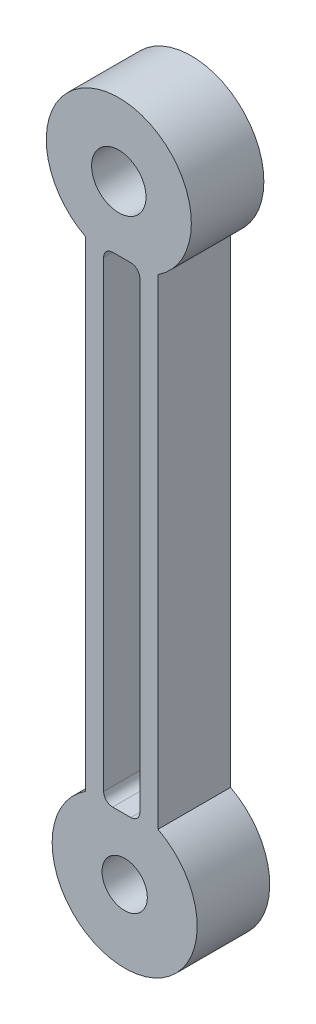
ISO-10303-21;
HEADER;
FILE_DESCRIPTION(('STEP AP214'),'2;1');
FILE_NAME('part.step','',(''),(''),'','','');
FILE_SCHEMA(('AUTOMOTIVE_DESIGN { 1 0 10303 214 1 1 1 1 }'));
ENDSEC;
DATA;
#1=APPLICATION_CONTEXT('core data for automotive mechanical design processes');
#2=APPLICATION_PROTOCOL_DEFINITION('international standard','automotive_design',2000,#1);
#3=PRODUCT_CONTEXT('',#1,'mechanical');
#4=PRODUCT('Part','Part','',(#3));
#5=PRODUCT_RELATED_PRODUCT_CATEGORY('part','',(#4));
#6=PRODUCT_DEFINITION_FORMATION('','',#4);
#7=PRODUCT_DEFINITION_CONTEXT('part definition',#1,'design');
#8=PRODUCT_DEFINITION('design','',#6,#7);
#9=PRODUCT_DEFINITION_SHAPE('','',#8);
#10=(LENGTH_UNIT() NAMED_UNIT(*) SI_UNIT(.MILLI.,.METRE.));
#11=(NAMED_UNIT(*) PLANE_ANGLE_UNIT() SI_UNIT($,.RADIAN.));
#12=(NAMED_UNIT(*) SI_UNIT($,.STERADIAN.) SOLID_ANGLE_UNIT());
#13=UNCERTAINTY_MEASURE_WITH_UNIT(LENGTH_MEASURE(1.E-05),#10,'distance_accuracy_value','');
#14=(GEOMETRIC_REPRESENTATION_CONTEXT(3) GLOBAL_UNCERTAINTY_ASSIGNED_CONTEXT((#13)) GLOBAL_UNIT_ASSIGNED_CONTEXT((#10,
#11,#12)) REPRESENTATION_CONTEXT('',''));
#15=CARTESIAN_POINT('',(0.,0.,0.));
#16=DIRECTION('',(0.,0.,1.));
#17=DIRECTION('',(1.,0.,0.));
#18=AXIS2_PLACEMENT_3D('',#15,#16,#17);
#19=CARTESIAN_POINT('',(0.,17.6256954531733,8.));
#20=DIRECTION('',(0.,1.,0.));
#21=DIRECTION('',(0.,0.,1.));
#22=AXIS2_PLACEMENT_3D('',#19,#20,#21);
#23=PLANE('',#22);
#24=DIRECTION('',(1.,0.,0.));
#25=VECTOR('',#24,1.);
#26=CARTESIAN_POINT('',(0.,17.6256954531733,0.));
#27=LINE('',#26,#25);
#28=CARTESIAN_POINT('',(-0.999999999999984,17.6256954531733,0.));
#29=VERTEX_POINT('',#28);
#30=CARTESIAN_POINT('',(1.,17.6256954531733,0.));
#31=VERTEX_POINT('',#30);
#32=EDGE_CURVE('E183',#29,#31,#27,.T.);
#33=ORIENTED_EDGE('',*,*,#32,.F.);
#34=DIRECTION('',(0.,0.,-1.));
#35=VECTOR('',#34,1.);
#36=CARTESIAN_POINT('',(-0.999999999999984,17.6256954531733,8.));
#37=LINE('',#36,#35);
#38=CARTESIAN_POINT('',(-0.999999999999984,17.6256954531733,8.));
#39=VERTEX_POINT('',#38);
#40=EDGE_CURVE('E11',#39,#29,#37,.T.);
#41=ORIENTED_EDGE('',*,*,#40,.F.);
#42=DIRECTION('',(1.,0.,0.));
#43=VECTOR('',#42,1.);
#44=CARTESIAN_POINT('',(0.,17.6256954531733,8.));
#45=LINE('',#44,#43);
#46=CARTESIAN_POINT('',(1.,17.6256954531733,8.));
#47=VERTEX_POINT('',#46);
#48=EDGE_CURVE('E297',#39,#47,#45,.T.);
#49=ORIENTED_EDGE('',*,*,#48,.T.);
#50=DIRECTION('',(0.,0.,-1.));
#51=VECTOR('',#50,1.);
#52=CARTESIAN_POINT('',(1.,17.6256954531733,8.));
#53=LINE('',#52,#51);
#54=EDGE_CURVE('E60',#47,#31,#53,.T.);
#55=ORIENTED_EDGE('',*,*,#54,.T.);
#56=EDGE_LOOP('',(#33,#41,#49,#55));
#57=FACE_BOUND('',#56,.T.);
#58=ADVANCED_FACE('F41',(#57),#23,.T.);
#59=CARTESIAN_POINT('',(-0.999999999999992,18.6256954531733,8.));
#60=DIRECTION('',(0.,0.,-1.));
#61=DIRECTION('',(-1.,0.,0.));
#62=AXIS2_PLACEMENT_3D('',#59,#60,#61);
#63=CYLINDRICAL_SURFACE('',#62,1.);
#64=CARTESIAN_POINT('',(-0.999999999999992,18.6256954531733,0.));
#65=DIRECTION('',(0.,0.,1.));
#66=DIRECTION('',(1.,0.,0.));
#67=AXIS2_PLACEMENT_3D('',#64,#65,#66);
#68=CIRCLE('',#67,1.);
#69=CARTESIAN_POINT('',(-1.99999999999999,18.6256954531733,0.));
#70=VERTEX_POINT('',#69);
#71=EDGE_CURVE('E185',#29,#70,#68,.F.);
#72=ORIENTED_EDGE('',*,*,#71,.T.);
#73=DIRECTION('',(0.,0.,-1.));
#74=VECTOR('',#73,1.);
#75=CARTESIAN_POINT('',(-1.99999999999999,18.6256954531733,8.));
#76=LINE('',#75,#74);
#77=CARTESIAN_POINT('',(-1.99999999999999,18.6256954531733,8.));
#78=VERTEX_POINT('',#77);
#79=EDGE_CURVE('E51',#78,#70,#76,.T.);
#80=ORIENTED_EDGE('',*,*,#79,.F.);
#81=CARTESIAN_POINT('',(-0.999999999999992,18.6256954531733,8.));
#82=DIRECTION('',(0.,0.,1.));
#83=DIRECTION('',(1.,0.,0.));
#84=AXIS2_PLACEMENT_3D('',#81,#82,#83);
#85=CIRCLE('',#84,1.);
#86=EDGE_CURVE('E299',#39,#78,#85,.F.);
#87=ORIENTED_EDGE('',*,*,#86,.F.);
#88=ORIENTED_EDGE('',*,*,#40,.T.);
#89=EDGE_LOOP('',(#72,#80,#87,#88));
#90=FACE_BOUND('',#89,.T.);
#91=ADVANCED_FACE('F248',(#90),#63,.F.);
#92=CARTESIAN_POINT('',(-1.99999999999999,0.,8.));
#93=DIRECTION('',(1.,0.,0.));
#94=DIRECTION('',(0.,1.,0.));
#95=AXIS2_PLACEMENT_3D('',#92,#93,#94);
#96=PLANE('',#95);
#97=DIRECTION('',(0.,-1.,0.));
#98=VECTOR('',#97,1.);
#99=CARTESIAN_POINT('',(-1.99999999999999,0.,0.));
#100=LINE('',#99,#98);
#101=CARTESIAN_POINT('',(-2.,69.6256954531733,0.));
#102=VERTEX_POINT('',#101);
#103=EDGE_CURVE('E188',#102,#70,#100,.T.);
#104=ORIENTED_EDGE('',*,*,#103,.F.);
#105=DIRECTION('',(0.,0.,-1.));
#106=VECTOR('',#105,1.);
#107=CARTESIAN_POINT('',(-2.,69.6256954531733,8.));
#108=LINE('',#107,#106);
#109=CARTESIAN_POINT('',(-2.,69.6256954531733,8.));
#110=VERTEX_POINT('',#109);
#111=EDGE_CURVE('E210',#110,#102,#108,.T.);
#112=ORIENTED_EDGE('',*,*,#111,.F.);
#113=DIRECTION('',(0.,-1.,0.));
#114=VECTOR('',#113,1.);
#115=CARTESIAN_POINT('',(-1.99999999999999,0.,8.));
#116=LINE('',#115,#114);
#117=EDGE_CURVE('E301',#110,#78,#116,.T.);
#118=ORIENTED_EDGE('',*,*,#117,.T.);
#119=ORIENTED_EDGE('',*,*,#79,.T.);
#120=EDGE_LOOP('',(#104,#112,#118,#119));
#121=FACE_BOUND('',#120,.T.);
#122=ADVANCED_FACE('F253',(#121),#96,.T.);
#123=CARTESIAN_POINT('',(-1.,69.6256954531733,8.));
#124=DIRECTION('',(0.,0.,-1.));
#125=DIRECTION('',(-1.,0.,0.));
#126=AXIS2_PLACEMENT_3D('',#123,#124,#125);
#127=CYLINDRICAL_SURFACE('',#126,1.);
#128=CARTESIAN_POINT('',(-1.,69.6256954531733,0.));
#129=DIRECTION('',(0.,0.,1.));
#130=DIRECTION('',(1.,0.,0.));
#131=AXIS2_PLACEMENT_3D('',#128,#129,#130);
#132=CIRCLE('',#131,1.);
#133=CARTESIAN_POINT('',(-1.,70.6256954531733,0.));
#134=VERTEX_POINT('',#133);
#135=EDGE_CURVE('E191',#102,#134,#132,.F.);
#136=ORIENTED_EDGE('',*,*,#135,.T.);
#137=DIRECTION('',(0.,0.,-1.));
#138=VECTOR('',#137,1.);
#139=CARTESIAN_POINT('',(-1.,70.6256954531733,8.));
#140=LINE('',#139,#138);
#141=CARTESIAN_POINT('',(-1.,70.6256954531733,8.));
#142=VERTEX_POINT('',#141);
#143=EDGE_CURVE('E207',#142,#134,#140,.T.);
#144=ORIENTED_EDGE('',*,*,#143,.F.);
#145=CARTESIAN_POINT('',(-1.,69.6256954531733,8.));
#146=DIRECTION('',(0.,0.,1.));
#147=DIRECTION('',(1.,0.,0.));
#148=AXIS2_PLACEMENT_3D('',#145,#146,#147);
#149=CIRCLE('',#148,1.);
#150=EDGE_CURVE('E304',#110,#142,#149,.F.);
#151=ORIENTED_EDGE('',*,*,#150,.F.);
#152=ORIENTED_EDGE('',*,*,#111,.T.);
#153=EDGE_LOOP('',(#136,#144,#151,#152));
#154=FACE_BOUND('',#153,.T.);
#155=ADVANCED_FACE('F259',(#154),#127,.F.);
#156=CARTESIAN_POINT('',(0.,70.6256954531733,8.));
#157=DIRECTION('',(0.,1.,0.));
#158=DIRECTION('',(0.,0.,1.));
#159=AXIS2_PLACEMENT_3D('',#156,#157,#158);
#160=PLANE('',#159);
#161=DIRECTION('',(1.,0.,0.));
#162=VECTOR('',#161,1.);
#163=CARTESIAN_POINT('',(0.,70.6256954531733,0.));
#164=LINE('',#163,#162);
#165=CARTESIAN_POINT('',(1.,70.6256954531733,0.));
#166=VERTEX_POINT('',#165);
#167=EDGE_CURVE('E194',#134,#166,#164,.T.);
#168=ORIENTED_EDGE('',*,*,#167,.T.);
#169=DIRECTION('',(0.,0.,-1.));
#170=VECTOR('',#169,1.);
#171=CARTESIAN_POINT('',(1.,70.6256954531733,8.));
#172=LINE('',#171,#170);
#173=CARTESIAN_POINT('',(1.,70.6256954531733,8.));
#174=VERTEX_POINT('',#173);
#175=EDGE_CURVE('E156',#174,#166,#172,.T.);
#176=ORIENTED_EDGE('',*,*,#175,.F.);
#177=DIRECTION('',(1.,0.,0.));
#178=VECTOR('',#177,1.);
#179=CARTESIAN_POINT('',(0.,70.6256954531733,8.));
#180=LINE('',#179,#178);
#181=EDGE_CURVE('E145',#142,#174,#180,.T.);
#182=ORIENTED_EDGE('',*,*,#181,.F.);
#183=ORIENTED_EDGE('',*,*,#143,.T.);
#184=EDGE_LOOP('',(#168,#176,#182,#183));
#185=FACE_BOUND('',#184,.T.);
#186=ADVANCED_FACE('F263',(#185),#160,.F.);
#187=CARTESIAN_POINT('',(1.,69.6256954531733,8.));
#188=DIRECTION('',(0.,0.,-1.));
#189=DIRECTION('',(-1.,0.,0.));
#190=AXIS2_PLACEMENT_3D('',#187,#188,#189);
#191=CYLINDRICAL_SURFACE('',#190,1.);
#192=CARTESIAN_POINT('',(1.,69.6256954531733,0.));
#193=DIRECTION('',(0.,0.,1.));
#194=DIRECTION('',(1.,0.,0.));
#195=AXIS2_PLACEMENT_3D('',#192,#193,#194);
#196=CIRCLE('',#195,1.);
#197=CARTESIAN_POINT('',(2.,69.6256954531733,0.));
#198=VERTEX_POINT('',#197);
#199=EDGE_CURVE('E153',#166,#198,#196,.F.);
#200=ORIENTED_EDGE('',*,*,#199,.T.);
#201=DIRECTION('',(0.,0.,-1.));
#202=VECTOR('',#201,1.);
#203=CARTESIAN_POINT('',(2.,69.6256954531733,8.));
#204=LINE('',#203,#202);
#205=CARTESIAN_POINT('',(2.,69.6256954531733,8.));
#206=VERTEX_POINT('',#205);
#207=EDGE_CURVE('E151',#206,#198,#204,.T.);
#208=ORIENTED_EDGE('',*,*,#207,.F.);
#209=CARTESIAN_POINT('',(1.,69.6256954531733,8.));
#210=DIRECTION('',(0.,0.,1.));
#211=DIRECTION('',(1.,0.,0.));
#212=AXIS2_PLACEMENT_3D('',#209,#210,#211);
#213=CIRCLE('',#212,1.);
#214=EDGE_CURVE('E137',#174,#206,#213,.F.);
#215=ORIENTED_EDGE('',*,*,#214,.F.);
#216=ORIENTED_EDGE('',*,*,#175,.T.);
#217=EDGE_LOOP('',(#200,#208,#215,#216));
#218=FACE_BOUND('',#217,.T.);
#219=ADVANCED_FACE('F152',(#218),#191,.F.);
#220=CARTESIAN_POINT('',(2.00000000000001,0.,8.));
#221=DIRECTION('',(-1.,0.,0.));
#222=DIRECTION('',(0.,-1.,0.));
#223=AXIS2_PLACEMENT_3D('',#220,#221,#222);
#224=PLANE('',#223);
#225=DIRECTION('',(0.,1.,0.));
#226=VECTOR('',#225,1.);
#227=CARTESIAN_POINT('',(2.00000000000001,0.,0.));
#228=LINE('',#227,#226);
#229=CARTESIAN_POINT('',(2.00000000000001,18.6256954531733,0.));
#230=VERTEX_POINT('',#229);
#231=EDGE_CURVE('E198',#230,#198,#228,.T.);
#232=ORIENTED_EDGE('',*,*,#231,.F.);
#233=DIRECTION('',(0.,0.,-1.));
#234=VECTOR('',#233,1.);
#235=CARTESIAN_POINT('',(2.00000000000001,18.6256954531733,8.));
#236=LINE('',#235,#234);
#237=CARTESIAN_POINT('',(2.00000000000001,18.6256954531733,8.));
#238=VERTEX_POINT('',#237);
#239=EDGE_CURVE('E97',#238,#230,#236,.T.);
#240=ORIENTED_EDGE('',*,*,#239,.F.);
#241=DIRECTION('',(0.,1.,0.));
#242=VECTOR('',#241,1.);
#243=CARTESIAN_POINT('',(2.00000000000001,0.,8.));
#244=LINE('',#243,#242);
#245=EDGE_CURVE('E143',#238,#206,#244,.T.);
#246=ORIENTED_EDGE('',*,*,#245,.T.);
#247=ORIENTED_EDGE('',*,*,#207,.T.);
#248=EDGE_LOOP('',(#232,#240,#246,#247));
#249=FACE_BOUND('',#248,.T.);
#250=ADVANCED_FACE('F158',(#249),#224,.T.);
#251=CARTESIAN_POINT('',(-4.,0.,8.));
#252=DIRECTION('',(-1.,0.,0.));
#253=DIRECTION('',(0.,0.,1.));
#254=AXIS2_PLACEMENT_3D('',#251,#252,#253);
#255=PLANE('',#254);
#256=DIRECTION('',(0.,1.,0.));
#257=VECTOR('',#256,1.);
#258=CARTESIAN_POINT('',(-4.,0.,0.));
#259=LINE('',#258,#257);
#260=CARTESIAN_POINT('',(-4.,17.6256954531733,0.));
#261=VERTEX_POINT('',#260);
#262=CARTESIAN_POINT('',(-4.,70.6256954531733,0.));
#263=VERTEX_POINT('',#262);
#264=EDGE_CURVE('E171',#261,#263,#259,.T.);
#265=ORIENTED_EDGE('',*,*,#264,.F.);
#266=DIRECTION('',(0.,0.,-1.));
#267=VECTOR('',#266,1.);
#268=CARTESIAN_POINT('',(-4.,17.6256954531733,8.));
#269=LINE('',#268,#267);
#270=CARTESIAN_POINT('',(-4.,17.6256954531733,8.));
#271=VERTEX_POINT('',#270);
#272=EDGE_CURVE('E45',#271,#261,#269,.T.);
#273=ORIENTED_EDGE('',*,*,#272,.F.);
#274=DIRECTION('',(0.,1.,0.));
#275=VECTOR('',#274,1.);
#276=CARTESIAN_POINT('',(-4.,0.,8.));
#277=LINE('',#276,#275);
#278=CARTESIAN_POINT('',(-4.,70.6256954531733,8.));
#279=VERTEX_POINT('',#278);
#280=EDGE_CURVE('E231',#271,#279,#277,.T.);
#281=ORIENTED_EDGE('',*,*,#280,.T.);
#282=DIRECTION('',(0.,0.,-1.));
#283=VECTOR('',#282,1.);
#284=CARTESIAN_POINT('',(-4.,70.6256954531733,8.));
#285=LINE('',#284,#283);
#286=EDGE_CURVE('E161',#279,#263,#285,.T.);
#287=ORIENTED_EDGE('',*,*,#286,.T.);
#288=EDGE_LOOP('',(#265,#273,#281,#287));
#289=FACE_BOUND('',#288,.T.);
#290=ADVANCED_FACE('F229',(#289),#255,.T.);
#291=CARTESIAN_POINT('',(0.323684855338101,10.894740894441,8.));
#292=DIRECTION('',(0.,0.,-1.));
#293=DIRECTION('',(-1.,0.,0.));
#294=AXIS2_PLACEMENT_3D('',#291,#292,#293);
#295=CYLINDRICAL_SURFACE('',#294,8.);
#296=CARTESIAN_POINT('',(0.323684855338101,10.894740894441,0.));
#297=DIRECTION('',(0.,0.,1.));
#298=DIRECTION('',(1.,0.,0.));
#299=AXIS2_PLACEMENT_3D('',#296,#297,#298);
#300=CIRCLE('',#299,8.);
#301=CARTESIAN_POINT('',(4.,18.,0.));
#302=VERTEX_POINT('',#301);
#303=EDGE_CURVE('E174',#261,#302,#300,.T.);
#304=ORIENTED_EDGE('',*,*,#303,.T.);
#305=DIRECTION('',(0.,0.,-1.));
#306=VECTOR('',#305,1.);
#307=CARTESIAN_POINT('',(4.,18.,8.));
#308=LINE('',#307,#306);
#309=CARTESIAN_POINT('',(4.,18.,8.));
#310=VERTEX_POINT('',#309);
#311=EDGE_CURVE('E216',#310,#302,#308,.T.);
#312=ORIENTED_EDGE('',*,*,#311,.F.);
#313=CARTESIAN_POINT('',(0.323684855338101,10.894740894441,8.));
#314=DIRECTION('',(0.,0.,1.));
#315=DIRECTION('',(1.,0.,0.));
#316=AXIS2_PLACEMENT_3D('',#313,#314,#315);
#317=CIRCLE('',#316,8.);
#318=EDGE_CURVE('E224',#271,#310,#317,.T.);
#319=ORIENTED_EDGE('',*,*,#318,.F.);
#320=ORIENTED_EDGE('',*,*,#272,.T.);
#321=EDGE_LOOP('',(#304,#312,#319,#320));
#322=FACE_BOUND('',#321,.T.);
#323=ADVANCED_FACE('F222',(#322),#295,.T.);
#324=CARTESIAN_POINT('',(4.,0.,8.));
#325=DIRECTION('',(-1.,0.,0.));
#326=DIRECTION('',(0.,0.,1.));
#327=AXIS2_PLACEMENT_3D('',#324,#325,#326);
#328=PLANE('',#327);
#329=DIRECTION('',(0.,1.,0.));
#330=VECTOR('',#329,1.);
#331=CARTESIAN_POINT('',(4.,0.,0.));
#332=LINE('',#331,#330);
#333=CARTESIAN_POINT('',(4.,71.,0.));
#334=VERTEX_POINT('',#333);
#335=EDGE_CURVE('E177',#302,#334,#332,.T.);
#336=ORIENTED_EDGE('',*,*,#335,.T.);
#337=DIRECTION('',(0.,0.,-1.));
#338=VECTOR('',#337,1.);
#339=CARTESIAN_POINT('',(4.,71.,8.));
#340=LINE('',#339,#338);
#341=CARTESIAN_POINT('',(4.,71.,8.));
#342=VERTEX_POINT('',#341);
#343=EDGE_CURVE('E214',#342,#334,#340,.T.);
#344=ORIENTED_EDGE('',*,*,#343,.F.);
#345=DIRECTION('',(0.,1.,0.));
#346=VECTOR('',#345,1.);
#347=CARTESIAN_POINT('',(4.,0.,8.));
#348=LINE('',#347,#346);
#349=EDGE_CURVE('E290',#310,#342,#348,.T.);
#350=ORIENTED_EDGE('',*,*,#349,.F.);
#351=ORIENTED_EDGE('',*,*,#311,.T.);
#352=EDGE_LOOP('',(#336,#344,#350,#351));
#353=FACE_BOUND('',#352,.T.);
#354=ADVANCED_FACE('F237',(#353),#328,.F.);
#355=CARTESIAN_POINT('',(-0.3236848553381,77.7309545587323,8.));
#356=DIRECTION('',(0.,0.,-1.));
#357=DIRECTION('',(-1.,0.,0.));
#358=AXIS2_PLACEMENT_3D('',#355,#356,#357);
#359=CYLINDRICAL_SURFACE('',#358,8.);
#360=CARTESIAN_POINT('',(-0.3236848553381,77.7309545587323,0.));
#361=DIRECTION('',(0.,0.,1.));
#362=DIRECTION('',(1.,0.,0.));
#363=AXIS2_PLACEMENT_3D('',#360,#361,#362);
#364=CIRCLE('',#363,8.);
#365=EDGE_CURVE('E180',#334,#263,#364,.T.);
#366=ORIENTED_EDGE('',*,*,#365,.T.);
#367=ORIENTED_EDGE('',*,*,#286,.F.);
#368=CARTESIAN_POINT('',(-0.3236848553381,77.7309545587323,8.));
#369=DIRECTION('',(0.,0.,1.));
#370=DIRECTION('',(1.,0.,0.));
#371=AXIS2_PLACEMENT_3D('',#368,#369,#370);
#372=CIRCLE('',#371,8.);
#373=EDGE_CURVE('E235',#342,#279,#372,.T.);
#374=ORIENTED_EDGE('',*,*,#373,.F.);
#375=ORIENTED_EDGE('',*,*,#343,.T.);
#376=EDGE_LOOP('',(#366,#367,#374,#375));
#377=FACE_BOUND('',#376,.T.);
#378=ADVANCED_FACE('F233',(#377),#359,.T.);
#379=CARTESIAN_POINT('',(-0.3236848553381,77.7309545587323,8.));
#380=DIRECTION('',(0.,0.,-1.));
#381=DIRECTION('',(-1.,0.,0.));
#382=AXIS2_PLACEMENT_3D('',#379,#380,#381);
#383=CYLINDRICAL_SURFACE('',#382,3.);
#384=CARTESIAN_POINT('',(-0.3236848553381,77.7309545587323,8.));
#385=DIRECTION('',(0.,0.,1.));
#386=DIRECTION('',(1.,0.,0.));
#387=AXIS2_PLACEMENT_3D('',#384,#385,#386);
#388=CIRCLE('',#387,3.);
#389=CARTESIAN_POINT('',(2.6763151446619,77.7309545587323,8.));
#390=VERTEX_POINT('',#389);
#391=EDGE_CURVE('E288',#390,#390,#388,.T.);
#392=ORIENTED_EDGE('',*,*,#391,.T.);
#393=EDGE_LOOP('',(#392));
#394=FACE_BOUND('',#393,.T.);
#395=CARTESIAN_POINT('',(-0.3236848553381,77.7309545587323,0.));
#396=DIRECTION('',(0.,0.,1.));
#397=DIRECTION('',(1.,0.,0.));
#398=AXIS2_PLACEMENT_3D('',#395,#396,#397);
#399=CIRCLE('',#398,3.);
#400=CARTESIAN_POINT('',(2.6763151446619,77.7309545587323,0.));
#401=VERTEX_POINT('',#400);
#402=EDGE_CURVE('E168',#401,#401,#399,.T.);
#403=ORIENTED_EDGE('',*,*,#402,.F.);
#404=EDGE_LOOP('',(#403));
#405=FACE_BOUND('',#404,.T.);
#406=ADVANCED_FACE('F244',(#394,#405),#383,.F.);
#407=CARTESIAN_POINT('',(0.323684855338101,10.894740894441,8.));
#408=DIRECTION('',(0.,0.,-1.));
#409=DIRECTION('',(-1.,0.,0.));
#410=AXIS2_PLACEMENT_3D('',#407,#408,#409);
#411=CYLINDRICAL_SURFACE('',#410,2.5);
#412=CARTESIAN_POINT('',(0.323684855338101,10.894740894441,8.));
#413=DIRECTION('',(0.,0.,1.));
#414=DIRECTION('',(1.,0.,0.));
#415=AXIS2_PLACEMENT_3D('',#412,#413,#414);
#416=CIRCLE('',#415,2.5);
#417=CARTESIAN_POINT('',(2.8236848553381,10.894740894441,8.));
#418=VERTEX_POINT('',#417);
#419=EDGE_CURVE('E203',#418,#418,#416,.T.);
#420=ORIENTED_EDGE('',*,*,#419,.T.);
#421=EDGE_LOOP('',(#420));
#422=FACE_BOUND('',#421,.T.);
#423=CARTESIAN_POINT('',(0.323684855338101,10.894740894441,0.));
#424=DIRECTION('',(0.,0.,1.));
#425=DIRECTION('',(1.,0.,0.));
#426=AXIS2_PLACEMENT_3D('',#423,#424,#425);
#427=CIRCLE('',#426,2.5);
#428=CARTESIAN_POINT('',(2.8236848553381,10.894740894441,0.));
#429=VERTEX_POINT('',#428);
#430=EDGE_CURVE('E165',#429,#429,#427,.T.);
#431=ORIENTED_EDGE('',*,*,#430,.F.);
#432=EDGE_LOOP('',(#431));
#433=FACE_BOUND('',#432,.T.);
#434=ADVANCED_FACE('F43',(#422,#433),#411,.F.);
#435=CARTESIAN_POINT('',(1.00000000000001,18.6256954531733,8.));
#436=DIRECTION('',(0.,0.,-1.));
#437=DIRECTION('',(-1.,0.,0.));
#438=AXIS2_PLACEMENT_3D('',#435,#436,#437);
#439=CYLINDRICAL_SURFACE('',#438,1.);
#440=CARTESIAN_POINT('',(1.00000000000001,18.6256954531733,0.));
#441=DIRECTION('',(0.,0.,1.));
#442=DIRECTION('',(1.,0.,0.));
#443=AXIS2_PLACEMENT_3D('',#440,#441,#442);
#444=CIRCLE('',#443,1.);
#445=EDGE_CURVE('E200',#31,#230,#444,.T.);
#446=ORIENTED_EDGE('',*,*,#445,.F.);
#447=ORIENTED_EDGE('',*,*,#54,.F.);
#448=CARTESIAN_POINT('',(1.00000000000001,18.6256954531733,8.));
#449=DIRECTION('',(0.,0.,1.));
#450=DIRECTION('',(1.,0.,0.));
#451=AXIS2_PLACEMENT_3D('',#448,#449,#450);
#452=CIRCLE('',#451,1.);
#453=EDGE_CURVE('E159',#47,#238,#452,.T.);
#454=ORIENTED_EDGE('',*,*,#453,.T.);
#455=ORIENTED_EDGE('',*,*,#239,.T.);
#456=EDGE_LOOP('',(#446,#447,#454,#455));
#457=FACE_BOUND('',#456,.T.);
#458=ADVANCED_FACE('F272',(#457),#439,.F.);
#459=CARTESIAN_POINT('',(0.,0.,8.));
#460=DIRECTION('',(0.,0.,1.));
#461=DIRECTION('',(1.,0.,0.));
#462=AXIS2_PLACEMENT_3D('',#459,#460,#461);
#463=PLANE('',#462);
#464=ORIENTED_EDGE('',*,*,#419,.F.);
#465=EDGE_LOOP('',(#464));
#466=FACE_BOUND('',#465,.T.);
#467=ORIENTED_EDGE('',*,*,#391,.F.);
#468=EDGE_LOOP('',(#467));
#469=FACE_BOUND('',#468,.T.);
#470=ORIENTED_EDGE('',*,*,#280,.F.);
#471=ORIENTED_EDGE('',*,*,#318,.T.);
#472=ORIENTED_EDGE('',*,*,#349,.T.);
#473=ORIENTED_EDGE('',*,*,#373,.T.);
#474=EDGE_LOOP('',(#470,#471,#472,#473));
#475=FACE_BOUND('',#474,.T.);
#476=ORIENTED_EDGE('',*,*,#48,.F.);
#477=ORIENTED_EDGE('',*,*,#86,.T.);
#478=ORIENTED_EDGE('',*,*,#117,.F.);
#479=ORIENTED_EDGE('',*,*,#150,.T.);
#480=ORIENTED_EDGE('',*,*,#181,.T.);
#481=ORIENTED_EDGE('',*,*,#214,.T.);
#482=ORIENTED_EDGE('',*,*,#245,.F.);
#483=ORIENTED_EDGE('',*,*,#453,.F.);
#484=EDGE_LOOP('',(#476,#477,#478,#479,#480,#481,#482,#483));
#485=FACE_BOUND('',#484,.T.);
#486=ADVANCED_FACE('F140',(#466,#469,#475,#485),#463,.T.);
#487=CARTESIAN_POINT('',(0.,0.,0.));
#488=DIRECTION('',(0.,0.,1.));
#489=DIRECTION('',(1.,0.,0.));
#490=AXIS2_PLACEMENT_3D('',#487,#488,#489);
#491=PLANE('',#490);
#492=ORIENTED_EDGE('',*,*,#430,.T.);
#493=EDGE_LOOP('',(#492));
#494=FACE_BOUND('',#493,.T.);
#495=ORIENTED_EDGE('',*,*,#402,.T.);
#496=EDGE_LOOP('',(#495));
#497=FACE_BOUND('',#496,.T.);
#498=ORIENTED_EDGE('',*,*,#264,.T.);
#499=ORIENTED_EDGE('',*,*,#365,.F.);
#500=ORIENTED_EDGE('',*,*,#335,.F.);
#501=ORIENTED_EDGE('',*,*,#303,.F.);
#502=EDGE_LOOP('',(#498,#499,#500,#501));
#503=FACE_BOUND('',#502,.T.);
#504=ORIENTED_EDGE('',*,*,#32,.T.);
#505=ORIENTED_EDGE('',*,*,#445,.T.);
#506=ORIENTED_EDGE('',*,*,#231,.T.);
#507=ORIENTED_EDGE('',*,*,#199,.F.);
#508=ORIENTED_EDGE('',*,*,#167,.F.);
#509=ORIENTED_EDGE('',*,*,#135,.F.);
#510=ORIENTED_EDGE('',*,*,#103,.T.);
#511=ORIENTED_EDGE('',*,*,#71,.F.);
#512=EDGE_LOOP('',(#504,#505,#506,#507,#508,#509,#510,#511));
#513=FACE_BOUND('',#512,.T.);
#514=ADVANCED_FACE('F227',(#494,#497,#503,#513),#491,.F.);
#515=CLOSED_SHELL('',(#58,#91,#122,#155,#186,#219,#250,#290,#323,#354,#378,#406,#434,#458,#486,#514));
#516=MANIFOLD_SOLID_BREP('B2',#515);
#517=ADVANCED_BREP_SHAPE_REPRESENTATION('',(#18,#516),#14);
#518=SHAPE_DEFINITION_REPRESENTATION(#9,#517);
ENDSEC;
END-ISO-10303-21;
